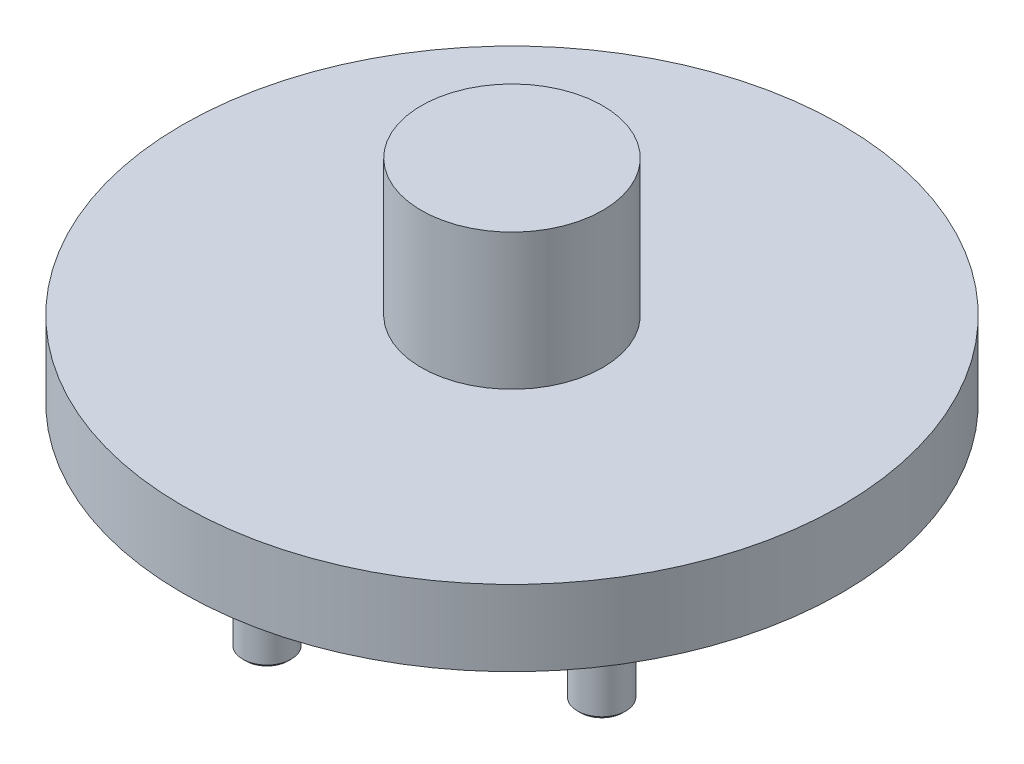
ISO-10303-21;
HEADER;
FILE_DESCRIPTION(('STEP AP214'),'2;1');
FILE_NAME('part.step','',(''),(''),'','','');
FILE_SCHEMA(('AUTOMOTIVE_DESIGN { 1 0 10303 214 1 1 1 1 }'));
ENDSEC;
DATA;
#1=APPLICATION_CONTEXT('core data for automotive mechanical design processes');
#2=APPLICATION_PROTOCOL_DEFINITION('international standard','automotive_design',2000,#1);
#3=PRODUCT_CONTEXT('',#1,'mechanical');
#4=PRODUCT('Part','Part','',(#3));
#5=PRODUCT_RELATED_PRODUCT_CATEGORY('part','',(#4));
#6=PRODUCT_DEFINITION_FORMATION('','',#4);
#7=PRODUCT_DEFINITION_CONTEXT('part definition',#1,'design');
#8=PRODUCT_DEFINITION('design','',#6,#7);
#9=PRODUCT_DEFINITION_SHAPE('','',#8);
#10=(LENGTH_UNIT() NAMED_UNIT(*) SI_UNIT(.MILLI.,.METRE.));
#11=(NAMED_UNIT(*) PLANE_ANGLE_UNIT() SI_UNIT($,.RADIAN.));
#12=(NAMED_UNIT(*) SI_UNIT($,.STERADIAN.) SOLID_ANGLE_UNIT());
#13=UNCERTAINTY_MEASURE_WITH_UNIT(LENGTH_MEASURE(1.E-05),#10,'distance_accuracy_value','');
#14=(GEOMETRIC_REPRESENTATION_CONTEXT(3) GLOBAL_UNCERTAINTY_ASSIGNED_CONTEXT((#13)) GLOBAL_UNIT_ASSIGNED_CONTEXT((#10,
#11,#12)) REPRESENTATION_CONTEXT('',''));
#15=CARTESIAN_POINT('',(0.,0.,0.));
#16=DIRECTION('',(0.,0.,1.));
#17=DIRECTION('',(1.,0.,0.));
#18=AXIS2_PLACEMENT_3D('',#15,#16,#17);
#19=CARTESIAN_POINT('',(0.,0.,0.));
#20=DIRECTION('',(0.,-1.,0.));
#21=DIRECTION('',(1.,0.,0.));
#22=AXIS2_PLACEMENT_3D('',#19,#20,#21);
#23=PLANE('',#22);
#24=CARTESIAN_POINT('',(0.,0.,0.));
#25=DIRECTION('',(0.,-1.,0.));
#26=DIRECTION('',(1.,0.,0.));
#27=AXIS2_PLACEMENT_3D('',#24,#25,#26);
#28=CIRCLE('',#27,53.);
#29=CARTESIAN_POINT('',(53.,0.,0.));
#30=VERTEX_POINT('',#29);
#31=EDGE_CURVE('E50',#30,#30,#28,.T.);
#32=ORIENTED_EDGE('',*,*,#31,.T.);
#33=EDGE_LOOP('',(#32));
#34=FACE_BOUND('',#33,.T.);
#35=ADVANCED_FACE('F38',(#34),#23,.T.);
#36=CARTESIAN_POINT('',(0.,0.,0.));
#37=DIRECTION('',(0.,-1.,0.));
#38=DIRECTION('',(1.,0.,0.));
#39=AXIS2_PLACEMENT_3D('',#36,#37,#38);
#40=CYLINDRICAL_SURFACE('',#39,53.);
#41=CARTESIAN_POINT('',(0.,5.,0.));
#42=DIRECTION('',(0.,-1.,0.));
#43=DIRECTION('',(1.,0.,0.));
#44=AXIS2_PLACEMENT_3D('',#41,#42,#43);
#45=CIRCLE('',#44,53.);
#46=CARTESIAN_POINT('',(53.,5.,0.));
#47=VERTEX_POINT('',#46);
#48=EDGE_CURVE('E54',#47,#47,#45,.T.);
#49=ORIENTED_EDGE('',*,*,#48,.T.);
#50=EDGE_LOOP('',(#49));
#51=FACE_BOUND('',#50,.T.);
#52=ORIENTED_EDGE('',*,*,#31,.F.);
#53=EDGE_LOOP('',(#52));
#54=FACE_BOUND('',#53,.T.);
#55=ADVANCED_FACE('F126',(#51,#54),#40,.T.);
#56=CARTESIAN_POINT('',(53.,5.,0.));
#57=DIRECTION('',(0.,-1.,0.));
#58=DIRECTION('',(1.,0.,0.));
#59=AXIS2_PLACEMENT_3D('',#56,#57,#58);
#60=PLANE('',#59);
#61=CARTESIAN_POINT('',(70.1480577065391,5.,40.5000000000008));
#62=DIRECTION('',(0.,-1.,0.));
#63=DIRECTION('',(0.50000000000001,0.,-0.866025403784433));
#64=AXIS2_PLACEMENT_3D('',#61,#62,#63);
#65=CIRCLE('',#64,8.);
#66=CARTESIAN_POINT('',(74.1480577065391,5.,33.5717967697254));
#67=VERTEX_POINT('',#66);
#68=EDGE_CURVE('E116',#67,#67,#65,.T.);
#69=ORIENTED_EDGE('',*,*,#68,.F.);
#70=EDGE_LOOP('',(#69));
#71=FACE_BOUND('',#70,.T.);
#72=CARTESIAN_POINT('',(70.1480577065399,5.,-40.4999999999993));
#73=DIRECTION('',(0.,-1.,0.));
#74=DIRECTION('',(-0.499999999999992,0.,-0.866025403784443));
#75=AXIS2_PLACEMENT_3D('',#72,#73,#74);
#76=CIRCLE('',#75,8.);
#77=CARTESIAN_POINT('',(66.14805770654,5.,-47.4282032302749));
#78=VERTEX_POINT('',#77);
#79=EDGE_CURVE('E107',#78,#78,#76,.T.);
#80=ORIENTED_EDGE('',*,*,#79,.F.);
#81=EDGE_LOOP('',(#80));
#82=FACE_BOUND('',#81,.T.);
#83=CARTESIAN_POINT('',(0.,5.,-81.));
#84=DIRECTION('',(0.,-1.,0.));
#85=DIRECTION('',(-1.,0.,0.));
#86=AXIS2_PLACEMENT_3D('',#83,#84,#85);
#87=CIRCLE('',#86,8.);
#88=CARTESIAN_POINT('',(-8.,5.,-81.));
#89=VERTEX_POINT('',#88);
#90=EDGE_CURVE('E98',#89,#89,#87,.T.);
#91=ORIENTED_EDGE('',*,*,#90,.F.);
#92=EDGE_LOOP('',(#91));
#93=FACE_BOUND('',#92,.T.);
#94=CARTESIAN_POINT('',(-70.1480577065393,5.,-40.5000000000003));
#95=DIRECTION('',(0.,-1.,0.));
#96=DIRECTION('',(-0.500000000000004,0.,0.866025403784436));
#97=AXIS2_PLACEMENT_3D('',#94,#95,#96);
#98=CIRCLE('',#97,8.);
#99=CARTESIAN_POINT('',(-74.1480577065394,5.,-33.5717967697248));
#100=VERTEX_POINT('',#99);
#101=EDGE_CURVE('E89',#100,#100,#98,.T.);
#102=ORIENTED_EDGE('',*,*,#101,.F.);
#103=EDGE_LOOP('',(#102));
#104=FACE_BOUND('',#103,.T.);
#105=CARTESIAN_POINT('',(-70.1480577065396,5.,40.4999999999998));
#106=DIRECTION('',(0.,-1.,0.));
#107=DIRECTION('',(0.499999999999998,0.,0.86602540378444));
#108=AXIS2_PLACEMENT_3D('',#105,#106,#107);
#109=CIRCLE('',#108,8.);
#110=CARTESIAN_POINT('',(-66.1480577065396,5.,47.4282032302754));
#111=VERTEX_POINT('',#110);
#112=EDGE_CURVE('E80',#111,#111,#109,.T.);
#113=ORIENTED_EDGE('',*,*,#112,.F.);
#114=EDGE_LOOP('',(#113));
#115=FACE_BOUND('',#114,.T.);
#116=CARTESIAN_POINT('',(0.,5.,81.));
#117=DIRECTION('',(0.,-1.,0.));
#118=DIRECTION('',(1.,0.,0.));
#119=AXIS2_PLACEMENT_3D('',#116,#117,#118);
#120=CIRCLE('',#119,8.);
#121=CARTESIAN_POINT('',(8.,5.,81.));
#122=VERTEX_POINT('',#121);
#123=EDGE_CURVE('E71',#122,#122,#120,.T.);
#124=ORIENTED_EDGE('',*,*,#123,.F.);
#125=EDGE_LOOP('',(#124));
#126=FACE_BOUND('',#125,.T.);
#127=CARTESIAN_POINT('',(0.,5.,0.));
#128=DIRECTION('',(0.,-1.,0.));
#129=DIRECTION('',(1.,0.,0.));
#130=AXIS2_PLACEMENT_3D('',#127,#128,#129);
#131=CIRCLE('',#130,109.);
#132=CARTESIAN_POINT('',(109.,5.,0.));
#133=VERTEX_POINT('',#132);
#134=EDGE_CURVE('E59',#133,#133,#131,.T.);
#135=ORIENTED_EDGE('',*,*,#134,.T.);
#136=EDGE_LOOP('',(#135));
#137=FACE_BOUND('',#136,.T.);
#138=ORIENTED_EDGE('',*,*,#48,.F.);
#139=EDGE_LOOP('',(#138));
#140=FACE_BOUND('',#139,.T.);
#141=ADVANCED_FACE('F122',(#71,#82,#93,#104,#115,#126,#137,#140),#60,.T.);
#142=CARTESIAN_POINT('',(0.,0.,0.));
#143=DIRECTION('',(0.,-1.,0.));
#144=DIRECTION('',(1.,0.,0.));
#145=AXIS2_PLACEMENT_3D('',#142,#143,#144);
#146=CYLINDRICAL_SURFACE('',#145,109.);
#147=CARTESIAN_POINT('',(0.,30.,0.));
#148=DIRECTION('',(0.,-1.,0.));
#149=DIRECTION('',(1.,0.,0.));
#150=AXIS2_PLACEMENT_3D('',#147,#148,#149);
#151=CIRCLE('',#150,109.);
#152=CARTESIAN_POINT('',(109.,30.,0.));
#153=VERTEX_POINT('',#152);
#154=EDGE_CURVE('E62',#153,#153,#151,.T.);
#155=ORIENTED_EDGE('',*,*,#154,.T.);
#156=EDGE_LOOP('',(#155));
#157=FACE_BOUND('',#156,.T.);
#158=ORIENTED_EDGE('',*,*,#134,.F.);
#159=EDGE_LOOP('',(#158));
#160=FACE_BOUND('',#159,.T.);
#161=ADVANCED_FACE('F125',(#157,#160),#146,.T.);
#162=CARTESIAN_POINT('',(109.,30.,0.));
#163=DIRECTION('',(0.,1.,0.));
#164=DIRECTION('',(-1.,0.,0.));
#165=AXIS2_PLACEMENT_3D('',#162,#163,#164);
#166=PLANE('',#165);
#167=CARTESIAN_POINT('',(0.,30.,0.));
#168=DIRECTION('',(0.,-1.,0.));
#169=DIRECTION('',(1.,0.,0.));
#170=AXIS2_PLACEMENT_3D('',#167,#168,#169);
#171=CIRCLE('',#170,30.);
#172=CARTESIAN_POINT('',(30.,30.,0.));
#173=VERTEX_POINT('',#172);
#174=EDGE_CURVE('E65',#173,#173,#171,.T.);
#175=ORIENTED_EDGE('',*,*,#174,.T.);
#176=EDGE_LOOP('',(#175));
#177=FACE_BOUND('',#176,.T.);
#178=ORIENTED_EDGE('',*,*,#154,.F.);
#179=EDGE_LOOP('',(#178));
#180=FACE_BOUND('',#179,.T.);
#181=ADVANCED_FACE('F153',(#177,#180),#166,.T.);
#182=CARTESIAN_POINT('',(0.,0.,0.));
#183=DIRECTION('',(0.,-1.,0.));
#184=DIRECTION('',(1.,0.,0.));
#185=AXIS2_PLACEMENT_3D('',#182,#183,#184);
#186=CYLINDRICAL_SURFACE('',#185,30.);
#187=CARTESIAN_POINT('',(0.,75.,0.));
#188=DIRECTION('',(0.,-1.,0.));
#189=DIRECTION('',(1.,0.,0.));
#190=AXIS2_PLACEMENT_3D('',#187,#188,#189);
#191=CIRCLE('',#190,30.);
#192=CARTESIAN_POINT('',(30.,75.,0.));
#193=VERTEX_POINT('',#192);
#194=EDGE_CURVE('E68',#193,#193,#191,.T.);
#195=ORIENTED_EDGE('',*,*,#194,.T.);
#196=EDGE_LOOP('',(#195));
#197=FACE_BOUND('',#196,.T.);
#198=ORIENTED_EDGE('',*,*,#174,.F.);
#199=EDGE_LOOP('',(#198));
#200=FACE_BOUND('',#199,.T.);
#201=ADVANCED_FACE('F157',(#197,#200),#186,.T.);
#202=CARTESIAN_POINT('',(30.,75.,0.));
#203=DIRECTION('',(0.,1.,0.));
#204=DIRECTION('',(-1.,0.,0.));
#205=AXIS2_PLACEMENT_3D('',#202,#203,#204);
#206=PLANE('',#205);
#207=ORIENTED_EDGE('',*,*,#194,.F.);
#208=EDGE_LOOP('',(#207));
#209=FACE_BOUND('',#208,.T.);
#210=ADVANCED_FACE('F161',(#209),#206,.T.);
#211=CARTESIAN_POINT('',(0.,-25.,81.));
#212=DIRECTION('',(0.,1.,0.));
#213=DIRECTION('',(-1.,0.,0.));
#214=AXIS2_PLACEMENT_3D('',#211,#212,#213);
#215=CYLINDRICAL_SURFACE('',#214,8.);
#216=CARTESIAN_POINT('',(0.,-24.,81.));
#217=DIRECTION('',(0.,-1.,0.));
#218=DIRECTION('',(1.,0.,0.));
#219=AXIS2_PLACEMENT_3D('',#216,#217,#218);
#220=CIRCLE('',#219,8.);
#221=CARTESIAN_POINT('',(8.,-24.,81.));
#222=VERTEX_POINT('',#221);
#223=EDGE_CURVE('E10',#222,#222,#220,.F.);
#224=ORIENTED_EDGE('',*,*,#223,.T.);
#225=EDGE_LOOP('',(#224));
#226=FACE_BOUND('',#225,.T.);
#227=ORIENTED_EDGE('',*,*,#123,.T.);
#228=EDGE_LOOP('',(#227));
#229=FACE_BOUND('',#228,.T.);
#230=ADVANCED_FACE('F165',(#226,#229),#215,.T.);
#231=CARTESIAN_POINT('',(0.,-25.,81.));
#232=DIRECTION('',(0.,-1.,0.));
#233=DIRECTION('',(1.,0.,0.));
#234=AXIS2_PLACEMENT_3D('',#231,#232,#233);
#235=PLANE('',#234);
#236=CARTESIAN_POINT('',(0.,-25.,81.));
#237=DIRECTION('',(0.,-1.,0.));
#238=DIRECTION('',(1.,0.,0.));
#239=AXIS2_PLACEMENT_3D('',#236,#237,#238);
#240=CIRCLE('',#239,7.00000000000003);
#241=CARTESIAN_POINT('',(7.00000000000003,-25.,81.));
#242=VERTEX_POINT('',#241);
#243=EDGE_CURVE('E46',#242,#242,#240,.T.);
#244=ORIENTED_EDGE('',*,*,#243,.T.);
#245=EDGE_LOOP('',(#244));
#246=FACE_BOUND('',#245,.T.);
#247=ADVANCED_FACE('F169',(#246),#235,.T.);
#248=CARTESIAN_POINT('',(0.,-25.,81.));
#249=DIRECTION('',(0.,1.,0.));
#250=DIRECTION('',(-1.,0.,0.));
#251=AXIS2_PLACEMENT_3D('',#248,#249,#250);
#252=CONICAL_SURFACE('',#251,7.00000000000003,0.785398163397448);
#253=ORIENTED_EDGE('',*,*,#223,.F.);
#254=EDGE_LOOP('',(#253));
#255=FACE_BOUND('',#254,.T.);
#256=ORIENTED_EDGE('',*,*,#243,.F.);
#257=EDGE_LOOP('',(#256));
#258=FACE_BOUND('',#257,.T.);
#259=ADVANCED_FACE('F41',(#255,#258),#252,.T.);
#260=CARTESIAN_POINT('',(-70.1480577065396,-25.,40.4999999999998));
#261=DIRECTION('',(0.,1.,0.));
#262=DIRECTION('',(-0.499999999999998,0.,-0.86602540378444));
#263=AXIS2_PLACEMENT_3D('',#260,#261,#262);
#264=CYLINDRICAL_SURFACE('',#263,8.);
#265=CARTESIAN_POINT('',(-70.1480577065396,-24.,40.4999999999998));
#266=DIRECTION('',(0.,-1.,0.));
#267=DIRECTION('',(0.499999999999998,0.,0.86602540378444));
#268=AXIS2_PLACEMENT_3D('',#265,#266,#267);
#269=CIRCLE('',#268,8.);
#270=CARTESIAN_POINT('',(-66.1480577065396,-24.,47.4282032302754));
#271=VERTEX_POINT('',#270);
#272=EDGE_CURVE('E77',#271,#271,#269,.F.);
#273=ORIENTED_EDGE('',*,*,#272,.T.);
#274=EDGE_LOOP('',(#273));
#275=FACE_BOUND('',#274,.T.);
#276=ORIENTED_EDGE('',*,*,#112,.T.);
#277=EDGE_LOOP('',(#276));
#278=FACE_BOUND('',#277,.T.);
#279=ADVANCED_FACE('F172',(#275,#278),#264,.T.);
#280=CARTESIAN_POINT('',(-70.1480577065396,-25.,40.4999999999998));
#281=DIRECTION('',(0.,-1.,0.));
#282=DIRECTION('',(0.499999999999998,0.,0.86602540378444));
#283=AXIS2_PLACEMENT_3D('',#280,#281,#282);
#284=PLANE('',#283);
#285=CARTESIAN_POINT('',(-70.1480577065396,-25.,40.4999999999998));
#286=DIRECTION('',(0.,-1.,0.));
#287=DIRECTION('',(0.499999999999998,0.,0.86602540378444));
#288=AXIS2_PLACEMENT_3D('',#285,#286,#287);
#289=CIRCLE('',#288,7.00000000000003);
#290=CARTESIAN_POINT('',(-66.6480577065396,-25.,46.5621778264909));
#291=VERTEX_POINT('',#290);
#292=EDGE_CURVE('E74',#291,#291,#289,.T.);
#293=ORIENTED_EDGE('',*,*,#292,.T.);
#294=EDGE_LOOP('',(#293));
#295=FACE_BOUND('',#294,.T.);
#296=ADVANCED_FACE('F175',(#295),#284,.T.);
#297=CARTESIAN_POINT('',(-70.1480577065396,-25.,40.4999999999998));
#298=DIRECTION('',(0.,1.,0.));
#299=DIRECTION('',(-0.499999999999998,0.,-0.86602540378444));
#300=AXIS2_PLACEMENT_3D('',#297,#298,#299);
#301=CONICAL_SURFACE('',#300,7.00000000000003,0.785398163397448);
#302=ORIENTED_EDGE('',*,*,#272,.F.);
#303=EDGE_LOOP('',(#302));
#304=FACE_BOUND('',#303,.T.);
#305=ORIENTED_EDGE('',*,*,#292,.F.);
#306=EDGE_LOOP('',(#305));
#307=FACE_BOUND('',#306,.T.);
#308=ADVANCED_FACE('F179',(#304,#307),#301,.T.);
#309=CARTESIAN_POINT('',(-70.1480577065393,-25.,-40.5000000000003));
#310=DIRECTION('',(0.,1.,0.));
#311=DIRECTION('',(0.500000000000004,0.,-0.866025403784436));
#312=AXIS2_PLACEMENT_3D('',#309,#310,#311);
#313=CYLINDRICAL_SURFACE('',#312,8.);
#314=CARTESIAN_POINT('',(-70.1480577065393,-24.,-40.5000000000003));
#315=DIRECTION('',(0.,-1.,0.));
#316=DIRECTION('',(-0.500000000000004,0.,0.866025403784436));
#317=AXIS2_PLACEMENT_3D('',#314,#315,#316);
#318=CIRCLE('',#317,8.);
#319=CARTESIAN_POINT('',(-74.1480577065394,-24.,-33.5717967697248));
#320=VERTEX_POINT('',#319);
#321=EDGE_CURVE('E86',#320,#320,#318,.F.);
#322=ORIENTED_EDGE('',*,*,#321,.T.);
#323=EDGE_LOOP('',(#322));
#324=FACE_BOUND('',#323,.T.);
#325=ORIENTED_EDGE('',*,*,#101,.T.);
#326=EDGE_LOOP('',(#325));
#327=FACE_BOUND('',#326,.T.);
#328=ADVANCED_FACE('F187',(#324,#327),#313,.T.);
#329=CARTESIAN_POINT('',(-70.1480577065393,-25.,-40.5000000000003));
#330=DIRECTION('',(0.,-1.,0.));
#331=DIRECTION('',(-0.500000000000004,0.,0.866025403784436));
#332=AXIS2_PLACEMENT_3D('',#329,#330,#331);
#333=PLANE('',#332);
#334=CARTESIAN_POINT('',(-70.1480577065393,-25.,-40.5000000000003));
#335=DIRECTION('',(0.,-1.,0.));
#336=DIRECTION('',(-0.500000000000004,0.,0.866025403784436));
#337=AXIS2_PLACEMENT_3D('',#334,#335,#336);
#338=CIRCLE('',#337,7.00000000000003);
#339=CARTESIAN_POINT('',(-73.6480577065394,-25.,-34.4378221735092));
#340=VERTEX_POINT('',#339);
#341=EDGE_CURVE('E83',#340,#340,#338,.T.);
#342=ORIENTED_EDGE('',*,*,#341,.T.);
#343=EDGE_LOOP('',(#342));
#344=FACE_BOUND('',#343,.T.);
#345=ADVANCED_FACE('F191',(#344),#333,.T.);
#346=CARTESIAN_POINT('',(-70.1480577065393,-25.,-40.5000000000003));
#347=DIRECTION('',(0.,1.,0.));
#348=DIRECTION('',(0.500000000000004,0.,-0.866025403784436));
#349=AXIS2_PLACEMENT_3D('',#346,#347,#348);
#350=CONICAL_SURFACE('',#349,7.00000000000003,0.785398163397448);
#351=ORIENTED_EDGE('',*,*,#321,.F.);
#352=EDGE_LOOP('',(#351));
#353=FACE_BOUND('',#352,.T.);
#354=ORIENTED_EDGE('',*,*,#341,.F.);
#355=EDGE_LOOP('',(#354));
#356=FACE_BOUND('',#355,.T.);
#357=ADVANCED_FACE('F195',(#353,#356),#350,.T.);
#358=CARTESIAN_POINT('',(0.,-25.,-81.));
#359=DIRECTION('',(0.,1.,0.));
#360=DIRECTION('',(1.,0.,0.));
#361=AXIS2_PLACEMENT_3D('',#358,#359,#360);
#362=CYLINDRICAL_SURFACE('',#361,8.);
#363=CARTESIAN_POINT('',(0.,-24.,-81.));
#364=DIRECTION('',(0.,-1.,0.));
#365=DIRECTION('',(-1.,0.,0.));
#366=AXIS2_PLACEMENT_3D('',#363,#364,#365);
#367=CIRCLE('',#366,8.);
#368=CARTESIAN_POINT('',(-8.,-24.,-81.));
#369=VERTEX_POINT('',#368);
#370=EDGE_CURVE('E95',#369,#369,#367,.F.);
#371=ORIENTED_EDGE('',*,*,#370,.T.);
#372=EDGE_LOOP('',(#371));
#373=FACE_BOUND('',#372,.T.);
#374=ORIENTED_EDGE('',*,*,#90,.T.);
#375=EDGE_LOOP('',(#374));
#376=FACE_BOUND('',#375,.T.);
#377=ADVANCED_FACE('F202',(#373,#376),#362,.T.);
#378=CARTESIAN_POINT('',(0.,-25.,-81.));
#379=DIRECTION('',(0.,-1.,0.));
#380=DIRECTION('',(-1.,0.,0.));
#381=AXIS2_PLACEMENT_3D('',#378,#379,#380);
#382=PLANE('',#381);
#383=CARTESIAN_POINT('',(0.,-25.,-81.));
#384=DIRECTION('',(0.,-1.,0.));
#385=DIRECTION('',(-1.,0.,0.));
#386=AXIS2_PLACEMENT_3D('',#383,#384,#385);
#387=CIRCLE('',#386,7.00000000000003);
#388=CARTESIAN_POINT('',(-7.00000000000003,-25.,-81.));
#389=VERTEX_POINT('',#388);
#390=EDGE_CURVE('E92',#389,#389,#387,.T.);
#391=ORIENTED_EDGE('',*,*,#390,.T.);
#392=EDGE_LOOP('',(#391));
#393=FACE_BOUND('',#392,.T.);
#394=ADVANCED_FACE('F206',(#393),#382,.T.);
#395=CARTESIAN_POINT('',(0.,-25.,-81.));
#396=DIRECTION('',(0.,1.,0.));
#397=DIRECTION('',(1.,0.,0.));
#398=AXIS2_PLACEMENT_3D('',#395,#396,#397);
#399=CONICAL_SURFACE('',#398,7.00000000000003,0.785398163397448);
#400=ORIENTED_EDGE('',*,*,#370,.F.);
#401=EDGE_LOOP('',(#400));
#402=FACE_BOUND('',#401,.T.);
#403=ORIENTED_EDGE('',*,*,#390,.F.);
#404=EDGE_LOOP('',(#403));
#405=FACE_BOUND('',#404,.T.);
#406=ADVANCED_FACE('F210',(#402,#405),#399,.T.);
#407=CARTESIAN_POINT('',(70.1480577065399,-25.,-40.4999999999993));
#408=DIRECTION('',(0.,1.,0.));
#409=DIRECTION('',(0.499999999999992,0.,0.866025403784443));
#410=AXIS2_PLACEMENT_3D('',#407,#408,#409);
#411=CYLINDRICAL_SURFACE('',#410,8.);
#412=CARTESIAN_POINT('',(70.1480577065399,-24.,-40.4999999999993));
#413=DIRECTION('',(0.,-1.,0.));
#414=DIRECTION('',(-0.499999999999992,0.,-0.866025403784443));
#415=AXIS2_PLACEMENT_3D('',#412,#413,#414);
#416=CIRCLE('',#415,8.);
#417=CARTESIAN_POINT('',(66.14805770654,-24.,-47.4282032302749));
#418=VERTEX_POINT('',#417);
#419=EDGE_CURVE('E104',#418,#418,#416,.F.);
#420=ORIENTED_EDGE('',*,*,#419,.T.);
#421=EDGE_LOOP('',(#420));
#422=FACE_BOUND('',#421,.T.);
#423=ORIENTED_EDGE('',*,*,#79,.T.);
#424=EDGE_LOOP('',(#423));
#425=FACE_BOUND('',#424,.T.);
#426=ADVANCED_FACE('F217',(#422,#425),#411,.T.);
#427=CARTESIAN_POINT('',(70.1480577065399,-25.,-40.4999999999993));
#428=DIRECTION('',(0.,-1.,0.));
#429=DIRECTION('',(-0.499999999999992,0.,-0.866025403784443));
#430=AXIS2_PLACEMENT_3D('',#427,#428,#429);
#431=PLANE('',#430);
#432=CARTESIAN_POINT('',(70.1480577065399,-25.,-40.4999999999993));
#433=DIRECTION('',(0.,-1.,0.));
#434=DIRECTION('',(-0.499999999999992,0.,-0.866025403784443));
#435=AXIS2_PLACEMENT_3D('',#432,#433,#434);
#436=CIRCLE('',#435,7.00000000000003);
#437=CARTESIAN_POINT('',(66.6480577065399,-25.,-46.5621778264905));
#438=VERTEX_POINT('',#437);
#439=EDGE_CURVE('E101',#438,#438,#436,.T.);
#440=ORIENTED_EDGE('',*,*,#439,.T.);
#441=EDGE_LOOP('',(#440));
#442=FACE_BOUND('',#441,.T.);
#443=ADVANCED_FACE('F221',(#442),#431,.T.);
#444=CARTESIAN_POINT('',(70.1480577065399,-25.,-40.4999999999993));
#445=DIRECTION('',(0.,1.,0.));
#446=DIRECTION('',(0.499999999999992,0.,0.866025403784443));
#447=AXIS2_PLACEMENT_3D('',#444,#445,#446);
#448=CONICAL_SURFACE('',#447,7.00000000000003,0.785398163397448);
#449=ORIENTED_EDGE('',*,*,#419,.F.);
#450=EDGE_LOOP('',(#449));
#451=FACE_BOUND('',#450,.T.);
#452=ORIENTED_EDGE('',*,*,#439,.F.);
#453=EDGE_LOOP('',(#452));
#454=FACE_BOUND('',#453,.T.);
#455=ADVANCED_FACE('F225',(#451,#454),#448,.T.);
#456=CARTESIAN_POINT('',(70.1480577065391,-25.,40.5000000000008));
#457=DIRECTION('',(0.,1.,0.));
#458=DIRECTION('',(-0.50000000000001,0.,0.866025403784433));
#459=AXIS2_PLACEMENT_3D('',#456,#457,#458);
#460=CYLINDRICAL_SURFACE('',#459,8.);
#461=CARTESIAN_POINT('',(70.1480577065391,-24.,40.5000000000008));
#462=DIRECTION('',(0.,-1.,0.));
#463=DIRECTION('',(0.50000000000001,0.,-0.866025403784433));
#464=AXIS2_PLACEMENT_3D('',#461,#462,#463);
#465=CIRCLE('',#464,8.);
#466=CARTESIAN_POINT('',(74.1480577065391,-24.,33.5717967697254));
#467=VERTEX_POINT('',#466);
#468=EDGE_CURVE('E113',#467,#467,#465,.F.);
#469=ORIENTED_EDGE('',*,*,#468,.T.);
#470=EDGE_LOOP('',(#469));
#471=FACE_BOUND('',#470,.T.);
#472=ORIENTED_EDGE('',*,*,#68,.T.);
#473=EDGE_LOOP('',(#472));
#474=FACE_BOUND('',#473,.T.);
#475=ADVANCED_FACE('F120',(#471,#474),#460,.T.);
#476=CARTESIAN_POINT('',(70.1480577065391,-25.,40.5000000000008));
#477=DIRECTION('',(0.,-1.,0.));
#478=DIRECTION('',(0.50000000000001,0.,-0.866025403784433));
#479=AXIS2_PLACEMENT_3D('',#476,#477,#478);
#480=PLANE('',#479);
#481=CARTESIAN_POINT('',(70.1480577065391,-25.,40.5000000000008));
#482=DIRECTION('',(0.,-1.,0.));
#483=DIRECTION('',(0.50000000000001,0.,-0.866025403784433));
#484=AXIS2_PLACEMENT_3D('',#481,#482,#483);
#485=CIRCLE('',#484,7.00000000000003);
#486=CARTESIAN_POINT('',(73.6480577065391,-25.,34.4378221735098));
#487=VERTEX_POINT('',#486);
#488=EDGE_CURVE('E110',#487,#487,#485,.T.);
#489=ORIENTED_EDGE('',*,*,#488,.T.);
#490=EDGE_LOOP('',(#489));
#491=FACE_BOUND('',#490,.T.);
#492=ADVANCED_FACE('F235',(#491),#480,.T.);
#493=CARTESIAN_POINT('',(70.1480577065391,-25.,40.5000000000008));
#494=DIRECTION('',(0.,1.,0.));
#495=DIRECTION('',(-0.50000000000001,0.,0.866025403784433));
#496=AXIS2_PLACEMENT_3D('',#493,#494,#495);
#497=CONICAL_SURFACE('',#496,7.00000000000003,0.785398163397448);
#498=ORIENTED_EDGE('',*,*,#468,.F.);
#499=EDGE_LOOP('',(#498));
#500=FACE_BOUND('',#499,.T.);
#501=ORIENTED_EDGE('',*,*,#488,.F.);
#502=EDGE_LOOP('',(#501));
#503=FACE_BOUND('',#502,.T.);
#504=ADVANCED_FACE('F239',(#500,#503),#497,.T.);
#505=CLOSED_SHELL('',(#35,#55,#141,#161,#181,#201,#210,#230,#247,#259,#279,#296,#308,#328,#345,
#357,#377,#394,#406,#426,#443,#455,#475,#492,#504));
#506=MANIFOLD_SOLID_BREP('B2',#505);
#507=ADVANCED_BREP_SHAPE_REPRESENTATION('',(#18,#506),#14);
#508=SHAPE_DEFINITION_REPRESENTATION(#9,#507);
ENDSEC;
END-ISO-10303-21;
